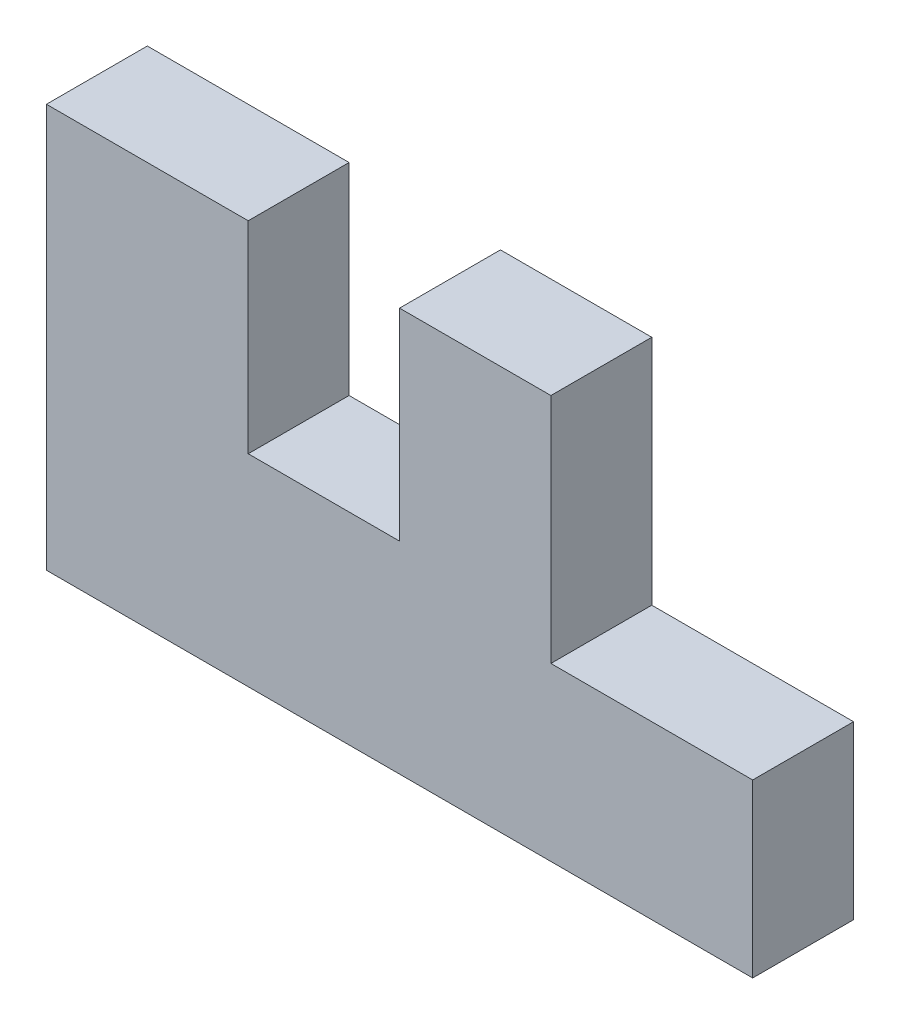
ISO-10303-21;
HEADER;
FILE_DESCRIPTION(('STEP AP214'),'2;1');
FILE_NAME('part.step','',(''),(''),'','','');
FILE_SCHEMA(('AUTOMOTIVE_DESIGN { 1 0 10303 214 1 1 1 1 }'));
ENDSEC;
DATA;
#1=APPLICATION_CONTEXT('core data for automotive mechanical design processes');
#2=APPLICATION_PROTOCOL_DEFINITION('international standard','automotive_design',2000,#1);
#3=PRODUCT_CONTEXT('',#1,'mechanical');
#4=PRODUCT('Part','Part','',(#3));
#5=PRODUCT_RELATED_PRODUCT_CATEGORY('part','',(#4));
#6=PRODUCT_DEFINITION_FORMATION('','',#4);
#7=PRODUCT_DEFINITION_CONTEXT('part definition',#1,'design');
#8=PRODUCT_DEFINITION('design','',#6,#7);
#9=PRODUCT_DEFINITION_SHAPE('','',#8);
#10=(LENGTH_UNIT() NAMED_UNIT(*) SI_UNIT(.MILLI.,.METRE.));
#11=(NAMED_UNIT(*) PLANE_ANGLE_UNIT() SI_UNIT($,.RADIAN.));
#12=(NAMED_UNIT(*) SI_UNIT($,.STERADIAN.) SOLID_ANGLE_UNIT());
#13=UNCERTAINTY_MEASURE_WITH_UNIT(LENGTH_MEASURE(1.E-05),#10,'distance_accuracy_value','');
#14=(GEOMETRIC_REPRESENTATION_CONTEXT(3) GLOBAL_UNCERTAINTY_ASSIGNED_CONTEXT((#13)) GLOBAL_UNIT_ASSIGNED_CONTEXT((#10,
#11,#12)) REPRESENTATION_CONTEXT('',''));
#15=CARTESIAN_POINT('',(0.,0.,0.));
#16=DIRECTION('',(0.,0.,1.));
#17=DIRECTION('',(1.,0.,0.));
#18=AXIS2_PLACEMENT_3D('',#15,#16,#17);
#19=CARTESIAN_POINT('',(0.,0.,12.7));
#20=DIRECTION('',(0.,1.,0.));
#21=DIRECTION('',(0.,0.,1.));
#22=AXIS2_PLACEMENT_3D('',#19,#20,#21);
#23=PLANE('',#22);
#24=DIRECTION('',(1.,0.,0.));
#25=VECTOR('',#24,1.);
#26=CARTESIAN_POINT('',(0.,0.,0.));
#27=LINE('',#26,#25);
#28=CARTESIAN_POINT('',(0.,0.,0.));
#29=VERTEX_POINT('',#28);
#30=CARTESIAN_POINT('',(88.9,0.,0.));
#31=VERTEX_POINT('',#30);
#32=EDGE_CURVE('E156',#29,#31,#27,.T.);
#33=ORIENTED_EDGE('',*,*,#32,.T.);
#34=DIRECTION('',(0.,0.,-1.));
#35=VECTOR('',#34,1.);
#36=CARTESIAN_POINT('',(88.9,0.,12.7));
#37=LINE('',#36,#35);
#38=CARTESIAN_POINT('',(88.9,0.,12.7));
#39=VERTEX_POINT('',#38);
#40=EDGE_CURVE('E11',#39,#31,#37,.T.);
#41=ORIENTED_EDGE('',*,*,#40,.F.);
#42=DIRECTION('',(1.,0.,0.));
#43=VECTOR('',#42,1.);
#44=CARTESIAN_POINT('',(0.,0.,12.7));
#45=LINE('',#44,#43);
#46=CARTESIAN_POINT('',(0.,0.,12.7));
#47=VERTEX_POINT('',#46);
#48=EDGE_CURVE('E184',#47,#39,#45,.T.);
#49=ORIENTED_EDGE('',*,*,#48,.F.);
#50=DIRECTION('',(0.,0.,-1.));
#51=VECTOR('',#50,1.);
#52=CARTESIAN_POINT('',(0.,0.,12.7));
#53=LINE('',#52,#51);
#54=EDGE_CURVE('E152',#47,#29,#53,.T.);
#55=ORIENTED_EDGE('',*,*,#54,.T.);
#56=EDGE_LOOP('',(#33,#41,#49,#55));
#57=FACE_BOUND('',#56,.T.);
#58=ADVANCED_FACE('F43',(#57),#23,.F.);
#59=CARTESIAN_POINT('',(88.9,21.59,12.7));
#60=DIRECTION('',(-1.,0.,0.));
#61=DIRECTION('',(0.,0.,1.));
#62=AXIS2_PLACEMENT_3D('',#59,#60,#61);
#63=PLANE('',#62);
#64=DIRECTION('',(0.,1.,0.));
#65=VECTOR('',#64,1.);
#66=CARTESIAN_POINT('',(88.9,21.59,0.));
#67=LINE('',#66,#65);
#68=CARTESIAN_POINT('',(88.9,21.59,0.));
#69=VERTEX_POINT('',#68);
#70=EDGE_CURVE('E160',#31,#69,#67,.T.);
#71=ORIENTED_EDGE('',*,*,#70,.T.);
#72=DIRECTION('',(0.,0.,-1.));
#73=VECTOR('',#72,1.);
#74=CARTESIAN_POINT('',(88.9,21.59,12.7));
#75=LINE('',#74,#73);
#76=CARTESIAN_POINT('',(88.9,21.59,12.7));
#77=VERTEX_POINT('',#76);
#78=EDGE_CURVE('E52',#77,#69,#75,.T.);
#79=ORIENTED_EDGE('',*,*,#78,.F.);
#80=DIRECTION('',(0.,1.,0.));
#81=VECTOR('',#80,1.);
#82=CARTESIAN_POINT('',(88.9,21.59,12.7));
#83=LINE('',#82,#81);
#84=EDGE_CURVE('E109',#39,#77,#83,.T.);
#85=ORIENTED_EDGE('',*,*,#84,.F.);
#86=ORIENTED_EDGE('',*,*,#40,.T.);
#87=EDGE_LOOP('',(#71,#79,#85,#86));
#88=FACE_BOUND('',#87,.T.);
#89=ADVANCED_FACE('F248',(#88),#63,.F.);
#90=CARTESIAN_POINT('',(63.5,21.59,12.7));
#91=DIRECTION('',(0.,-1.,0.));
#92=DIRECTION('',(0.,0.,-1.));
#93=AXIS2_PLACEMENT_3D('',#90,#91,#92);
#94=PLANE('',#93);
#95=DIRECTION('',(-1.,0.,0.));
#96=VECTOR('',#95,1.);
#97=CARTESIAN_POINT('',(63.5,21.59,0.));
#98=LINE('',#97,#96);
#99=CARTESIAN_POINT('',(63.5,21.59,0.));
#100=VERTEX_POINT('',#99);
#101=EDGE_CURVE('E163',#69,#100,#98,.T.);
#102=ORIENTED_EDGE('',*,*,#101,.T.);
#103=DIRECTION('',(0.,0.,-1.));
#104=VECTOR('',#103,1.);
#105=CARTESIAN_POINT('',(63.5,21.59,12.7));
#106=LINE('',#105,#104);
#107=CARTESIAN_POINT('',(63.5,21.59,12.7));
#108=VERTEX_POINT('',#107);
#109=EDGE_CURVE('E203',#108,#100,#106,.T.);
#110=ORIENTED_EDGE('',*,*,#109,.F.);
#111=DIRECTION('',(-1.,0.,0.));
#112=VECTOR('',#111,1.);
#113=CARTESIAN_POINT('',(63.5,21.59,12.7));
#114=LINE('',#113,#112);
#115=EDGE_CURVE('E213',#77,#108,#114,.T.);
#116=ORIENTED_EDGE('',*,*,#115,.F.);
#117=ORIENTED_EDGE('',*,*,#78,.T.);
#118=EDGE_LOOP('',(#102,#110,#116,#117));
#119=FACE_BOUND('',#118,.T.);
#120=ADVANCED_FACE('F211',(#119),#94,.F.);
#121=CARTESIAN_POINT('',(63.5,50.8,12.7));
#122=DIRECTION('',(-1.,0.,0.));
#123=DIRECTION('',(0.,0.,1.));
#124=AXIS2_PLACEMENT_3D('',#121,#122,#123);
#125=PLANE('',#124);
#126=DIRECTION('',(0.,1.,0.));
#127=VECTOR('',#126,1.);
#128=CARTESIAN_POINT('',(63.5,50.8,0.));
#129=LINE('',#128,#127);
#130=CARTESIAN_POINT('',(63.5,50.8,0.));
#131=VERTEX_POINT('',#130);
#132=EDGE_CURVE('E166',#100,#131,#129,.T.);
#133=ORIENTED_EDGE('',*,*,#132,.T.);
#134=DIRECTION('',(0.,0.,-1.));
#135=VECTOR('',#134,1.);
#136=CARTESIAN_POINT('',(63.5,50.8,12.7));
#137=LINE('',#136,#135);
#138=CARTESIAN_POINT('',(63.5,50.8,12.7));
#139=VERTEX_POINT('',#138);
#140=EDGE_CURVE('E199',#139,#131,#137,.T.);
#141=ORIENTED_EDGE('',*,*,#140,.F.);
#142=DIRECTION('',(0.,1.,0.));
#143=VECTOR('',#142,1.);
#144=CARTESIAN_POINT('',(63.5,50.8,12.7));
#145=LINE('',#144,#143);
#146=EDGE_CURVE('E232',#108,#139,#145,.T.);
#147=ORIENTED_EDGE('',*,*,#146,.F.);
#148=ORIENTED_EDGE('',*,*,#109,.T.);
#149=EDGE_LOOP('',(#133,#141,#147,#148));
#150=FACE_BOUND('',#149,.T.);
#151=ADVANCED_FACE('F222',(#150),#125,.F.);
#152=CARTESIAN_POINT('',(44.45,50.8,12.7));
#153=DIRECTION('',(0.,-1.,0.));
#154=DIRECTION('',(0.,0.,-1.));
#155=AXIS2_PLACEMENT_3D('',#152,#153,#154);
#156=PLANE('',#155);
#157=DIRECTION('',(-1.,0.,0.));
#158=VECTOR('',#157,1.);
#159=CARTESIAN_POINT('',(44.45,50.8,0.));
#160=LINE('',#159,#158);
#161=CARTESIAN_POINT('',(44.45,50.8,0.));
#162=VERTEX_POINT('',#161);
#163=EDGE_CURVE('E169',#131,#162,#160,.T.);
#164=ORIENTED_EDGE('',*,*,#163,.T.);
#165=DIRECTION('',(0.,0.,-1.));
#166=VECTOR('',#165,1.);
#167=CARTESIAN_POINT('',(44.45,50.8,12.7));
#168=LINE('',#167,#166);
#169=CARTESIAN_POINT('',(44.45,50.8,12.7));
#170=VERTEX_POINT('',#169);
#171=EDGE_CURVE('E195',#170,#162,#168,.T.);
#172=ORIENTED_EDGE('',*,*,#171,.F.);
#173=DIRECTION('',(-1.,0.,0.));
#174=VECTOR('',#173,1.);
#175=CARTESIAN_POINT('',(44.45,50.8,12.7));
#176=LINE('',#175,#174);
#177=EDGE_CURVE('E228',#139,#170,#176,.T.);
#178=ORIENTED_EDGE('',*,*,#177,.F.);
#179=ORIENTED_EDGE('',*,*,#140,.T.);
#180=EDGE_LOOP('',(#164,#172,#178,#179));
#181=FACE_BOUND('',#180,.T.);
#182=ADVANCED_FACE('F226',(#181),#156,.F.);
#183=CARTESIAN_POINT('',(44.45,25.4,12.7));
#184=DIRECTION('',(1.,0.,0.));
#185=DIRECTION('',(0.,0.,-1.));
#186=AXIS2_PLACEMENT_3D('',#183,#184,#185);
#187=PLANE('',#186);
#188=DIRECTION('',(0.,-1.,0.));
#189=VECTOR('',#188,1.);
#190=CARTESIAN_POINT('',(44.45,25.4,0.));
#191=LINE('',#190,#189);
#192=CARTESIAN_POINT('',(44.45,25.4,0.));
#193=VERTEX_POINT('',#192);
#194=EDGE_CURVE('E172',#162,#193,#191,.T.);
#195=ORIENTED_EDGE('',*,*,#194,.T.);
#196=DIRECTION('',(0.,0.,-1.));
#197=VECTOR('',#196,1.);
#198=CARTESIAN_POINT('',(44.45,25.4,12.7));
#199=LINE('',#198,#197);
#200=CARTESIAN_POINT('',(44.45,25.4,12.7));
#201=VERTEX_POINT('',#200);
#202=EDGE_CURVE('E191',#201,#193,#199,.T.);
#203=ORIENTED_EDGE('',*,*,#202,.F.);
#204=DIRECTION('',(0.,-1.,0.));
#205=VECTOR('',#204,1.);
#206=CARTESIAN_POINT('',(44.45,25.4,12.7));
#207=LINE('',#206,#205);
#208=EDGE_CURVE('E231',#170,#201,#207,.T.);
#209=ORIENTED_EDGE('',*,*,#208,.F.);
#210=ORIENTED_EDGE('',*,*,#171,.T.);
#211=EDGE_LOOP('',(#195,#203,#209,#210));
#212=FACE_BOUND('',#211,.T.);
#213=ADVANCED_FACE('F260',(#212),#187,.F.);
#214=CARTESIAN_POINT('',(25.4,25.4,12.7));
#215=DIRECTION('',(0.,-1.,0.));
#216=DIRECTION('',(0.,0.,-1.));
#217=AXIS2_PLACEMENT_3D('',#214,#215,#216);
#218=PLANE('',#217);
#219=DIRECTION('',(-1.,0.,0.));
#220=VECTOR('',#219,1.);
#221=CARTESIAN_POINT('',(25.4,25.4,0.));
#222=LINE('',#221,#220);
#223=CARTESIAN_POINT('',(25.4,25.4,0.));
#224=VERTEX_POINT('',#223);
#225=EDGE_CURVE('E175',#193,#224,#222,.T.);
#226=ORIENTED_EDGE('',*,*,#225,.T.);
#227=DIRECTION('',(0.,0.,-1.));
#228=VECTOR('',#227,1.);
#229=CARTESIAN_POINT('',(25.4,25.4,12.7));
#230=LINE('',#229,#228);
#231=CARTESIAN_POINT('',(25.4,25.4,12.7));
#232=VERTEX_POINT('',#231);
#233=EDGE_CURVE('E145',#232,#224,#230,.T.);
#234=ORIENTED_EDGE('',*,*,#233,.F.);
#235=DIRECTION('',(-1.,0.,0.));
#236=VECTOR('',#235,1.);
#237=CARTESIAN_POINT('',(25.4,25.4,12.7));
#238=LINE('',#237,#236);
#239=EDGE_CURVE('E134',#201,#232,#238,.T.);
#240=ORIENTED_EDGE('',*,*,#239,.F.);
#241=ORIENTED_EDGE('',*,*,#202,.T.);
#242=EDGE_LOOP('',(#226,#234,#240,#241));
#243=FACE_BOUND('',#242,.T.);
#244=ADVANCED_FACE('F263',(#243),#218,.F.);
#245=CARTESIAN_POINT('',(25.4,50.8,12.7));
#246=DIRECTION('',(-1.,0.,0.));
#247=DIRECTION('',(0.,-1.,0.));
#248=AXIS2_PLACEMENT_3D('',#245,#246,#247);
#249=PLANE('',#248);
#250=DIRECTION('',(0.,1.,0.));
#251=VECTOR('',#250,1.);
#252=CARTESIAN_POINT('',(25.4,50.8,0.));
#253=LINE('',#252,#251);
#254=CARTESIAN_POINT('',(25.4,50.8,0.));
#255=VERTEX_POINT('',#254);
#256=EDGE_CURVE('E143',#224,#255,#253,.T.);
#257=ORIENTED_EDGE('',*,*,#256,.T.);
#258=DIRECTION('',(0.,0.,-1.));
#259=VECTOR('',#258,1.);
#260=CARTESIAN_POINT('',(25.4,50.8,12.7));
#261=LINE('',#260,#259);
#262=CARTESIAN_POINT('',(25.4,50.8,12.7));
#263=VERTEX_POINT('',#262);
#264=EDGE_CURVE('E140',#263,#255,#261,.T.);
#265=ORIENTED_EDGE('',*,*,#264,.F.);
#266=DIRECTION('',(0.,1.,0.));
#267=VECTOR('',#266,1.);
#268=CARTESIAN_POINT('',(25.4,50.8,12.7));
#269=LINE('',#268,#267);
#270=EDGE_CURVE('E128',#232,#263,#269,.T.);
#271=ORIENTED_EDGE('',*,*,#270,.F.);
#272=ORIENTED_EDGE('',*,*,#233,.T.);
#273=EDGE_LOOP('',(#257,#265,#271,#272));
#274=FACE_BOUND('',#273,.T.);
#275=ADVANCED_FACE('F141',(#274),#249,.F.);
#276=CARTESIAN_POINT('',(0.,50.8,12.7));
#277=DIRECTION('',(0.,-1.,0.));
#278=DIRECTION('',(0.,0.,-1.));
#279=AXIS2_PLACEMENT_3D('',#276,#277,#278);
#280=PLANE('',#279);
#281=DIRECTION('',(-1.,0.,0.));
#282=VECTOR('',#281,1.);
#283=CARTESIAN_POINT('',(0.,50.8,0.));
#284=LINE('',#283,#282);
#285=CARTESIAN_POINT('',(0.,50.8,0.));
#286=VERTEX_POINT('',#285);
#287=EDGE_CURVE('E95',#255,#286,#284,.T.);
#288=ORIENTED_EDGE('',*,*,#287,.T.);
#289=DIRECTION('',(0.,0.,-1.));
#290=VECTOR('',#289,1.);
#291=CARTESIAN_POINT('',(0.,50.8,12.7));
#292=LINE('',#291,#290);
#293=CARTESIAN_POINT('',(0.,50.8,12.7));
#294=VERTEX_POINT('',#293);
#295=EDGE_CURVE('E146',#294,#286,#292,.T.);
#296=ORIENTED_EDGE('',*,*,#295,.F.);
#297=DIRECTION('',(-1.,0.,0.));
#298=VECTOR('',#297,1.);
#299=CARTESIAN_POINT('',(0.,50.8,12.7));
#300=LINE('',#299,#298);
#301=EDGE_CURVE('E132',#263,#294,#300,.T.);
#302=ORIENTED_EDGE('',*,*,#301,.F.);
#303=ORIENTED_EDGE('',*,*,#264,.T.);
#304=EDGE_LOOP('',(#288,#296,#302,#303));
#305=FACE_BOUND('',#304,.T.);
#306=ADVANCED_FACE('F148',(#305),#280,.F.);
#307=CARTESIAN_POINT('',(0.,0.,12.7));
#308=DIRECTION('',(1.,0.,0.));
#309=DIRECTION('',(0.,0.,-1.));
#310=AXIS2_PLACEMENT_3D('',#307,#308,#309);
#311=PLANE('',#310);
#312=DIRECTION('',(0.,-1.,0.));
#313=VECTOR('',#312,1.);
#314=CARTESIAN_POINT('',(0.,0.,0.));
#315=LINE('',#314,#313);
#316=EDGE_CURVE('E101',#286,#29,#315,.T.);
#317=ORIENTED_EDGE('',*,*,#316,.T.);
#318=ORIENTED_EDGE('',*,*,#54,.F.);
#319=DIRECTION('',(0.,-1.,0.));
#320=VECTOR('',#319,1.);
#321=CARTESIAN_POINT('',(0.,0.,12.7));
#322=LINE('',#321,#320);
#323=EDGE_CURVE('E60',#294,#47,#322,.T.);
#324=ORIENTED_EDGE('',*,*,#323,.F.);
#325=ORIENTED_EDGE('',*,*,#295,.T.);
#326=EDGE_LOOP('',(#317,#318,#324,#325));
#327=FACE_BOUND('',#326,.T.);
#328=ADVANCED_FACE('F272',(#327),#311,.F.);
#329=CARTESIAN_POINT('',(0.,0.,12.7));
#330=DIRECTION('',(0.,0.,-1.));
#331=DIRECTION('',(-1.,0.,0.));
#332=AXIS2_PLACEMENT_3D('',#329,#330,#331);
#333=PLANE('',#332);
#334=ORIENTED_EDGE('',*,*,#48,.T.);
#335=ORIENTED_EDGE('',*,*,#84,.T.);
#336=ORIENTED_EDGE('',*,*,#115,.T.);
#337=ORIENTED_EDGE('',*,*,#146,.T.);
#338=ORIENTED_EDGE('',*,*,#177,.T.);
#339=ORIENTED_EDGE('',*,*,#208,.T.);
#340=ORIENTED_EDGE('',*,*,#239,.T.);
#341=ORIENTED_EDGE('',*,*,#270,.T.);
#342=ORIENTED_EDGE('',*,*,#301,.T.);
#343=ORIENTED_EDGE('',*,*,#323,.T.);
#344=EDGE_LOOP('',(#334,#335,#336,#337,#338,#339,#340,#341,#342,#343));
#345=FACE_BOUND('',#344,.T.);
#346=ADVANCED_FACE('F130',(#345),#333,.F.);
#347=CARTESIAN_POINT('',(0.,0.,0.));
#348=DIRECTION('',(0.,0.,-1.));
#349=DIRECTION('',(-1.,0.,0.));
#350=AXIS2_PLACEMENT_3D('',#347,#348,#349);
#351=PLANE('',#350);
#352=ORIENTED_EDGE('',*,*,#32,.F.);
#353=ORIENTED_EDGE('',*,*,#316,.F.);
#354=ORIENTED_EDGE('',*,*,#287,.F.);
#355=ORIENTED_EDGE('',*,*,#256,.F.);
#356=ORIENTED_EDGE('',*,*,#225,.F.);
#357=ORIENTED_EDGE('',*,*,#194,.F.);
#358=ORIENTED_EDGE('',*,*,#163,.F.);
#359=ORIENTED_EDGE('',*,*,#132,.F.);
#360=ORIENTED_EDGE('',*,*,#101,.F.);
#361=ORIENTED_EDGE('',*,*,#70,.F.);
#362=EDGE_LOOP('',(#352,#353,#354,#355,#356,#357,#358,#359,#360,#361));
#363=FACE_BOUND('',#362,.T.);
#364=ADVANCED_FACE('F217',(#363),#351,.T.);
#365=CLOSED_SHELL('',(#58,#89,#120,#151,#182,#213,#244,#275,#306,#328,#346,#364));
#366=MANIFOLD_SOLID_BREP('B2',#365);
#367=ADVANCED_BREP_SHAPE_REPRESENTATION('',(#18,#366),#14);
#368=SHAPE_DEFINITION_REPRESENTATION(#9,#367);
ENDSEC;
END-ISO-10303-21;
